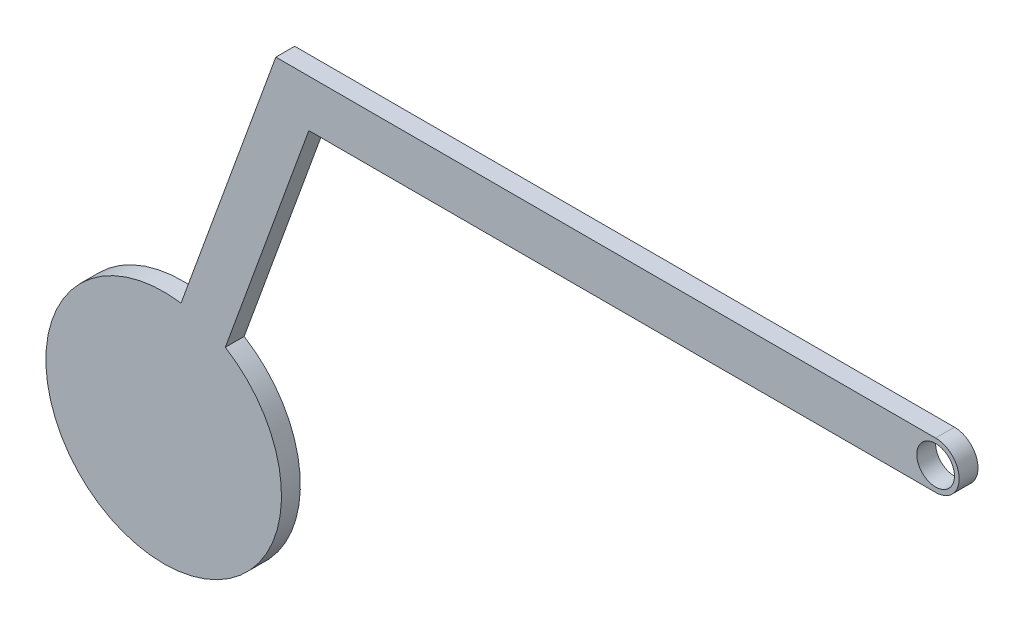
ISO-10303-21;
HEADER;
FILE_DESCRIPTION(('STEP AP214'),'2;1');
FILE_NAME('part.step','',(''),(''),'','','');
FILE_SCHEMA(('AUTOMOTIVE_DESIGN { 1 0 10303 214 1 1 1 1 }'));
ENDSEC;
DATA;
#1=APPLICATION_CONTEXT('core data for automotive mechanical design processes');
#2=APPLICATION_PROTOCOL_DEFINITION('international standard','automotive_design',2000,#1);
#3=PRODUCT_CONTEXT('',#1,'mechanical');
#4=PRODUCT('Part','Part','',(#3));
#5=PRODUCT_RELATED_PRODUCT_CATEGORY('part','',(#4));
#6=PRODUCT_DEFINITION_FORMATION('','',#4);
#7=PRODUCT_DEFINITION_CONTEXT('part definition',#1,'design');
#8=PRODUCT_DEFINITION('design','',#6,#7);
#9=PRODUCT_DEFINITION_SHAPE('','',#8);
#10=(LENGTH_UNIT() NAMED_UNIT(*) SI_UNIT(.MILLI.,.METRE.));
#11=(NAMED_UNIT(*) PLANE_ANGLE_UNIT() SI_UNIT($,.RADIAN.));
#12=(NAMED_UNIT(*) SI_UNIT($,.STERADIAN.) SOLID_ANGLE_UNIT());
#13=UNCERTAINTY_MEASURE_WITH_UNIT(LENGTH_MEASURE(1.E-05),#10,'distance_accuracy_value','');
#14=(GEOMETRIC_REPRESENTATION_CONTEXT(3) GLOBAL_UNCERTAINTY_ASSIGNED_CONTEXT((#13)) GLOBAL_UNIT_ASSIGNED_CONTEXT((#10,
#11,#12)) REPRESENTATION_CONTEXT('',''));
#15=CARTESIAN_POINT('',(0.,0.,0.));
#16=DIRECTION('',(0.,0.,1.));
#17=DIRECTION('',(1.,0.,0.));
#18=AXIS2_PLACEMENT_3D('',#15,#16,#17);
#19=CARTESIAN_POINT('',(9.50352638406391,33.4202056621128,2.));
#20=DIRECTION('',(-0.939692466867992,0.342020566211371,0.));
#21=DIRECTION('',(-0.342020566211371,-0.939692466867992,0.));
#22=AXIS2_PLACEMENT_3D('',#19,#20,#21);
#23=PLANE('',#22);
#24=DIRECTION('',(0.342020566211371,0.939692466867992,0.));
#25=VECTOR('',#24,1.);
#26=CARTESIAN_POINT('',(9.50352638406391,33.4202056621128,0.));
#27=LINE('',#26,#25);
#28=CARTESIAN_POINT('',(1.83964261254032,12.3638875382351,0.));
#29=VERTEX_POINT('',#28);
#30=CARTESIAN_POINT('',(11.8983790239911,40.,0.));
#31=VERTEX_POINT('',#30);
#32=EDGE_CURVE('E82',#29,#31,#27,.T.);
#33=ORIENTED_EDGE('',*,*,#32,.F.);
#34=DIRECTION('',(0.,0.,-1.));
#35=VECTOR('',#34,1.);
#36=CARTESIAN_POINT('',(1.83964261254032,12.3638875382351,2.));
#37=LINE('',#36,#35);
#38=CARTESIAN_POINT('',(1.83964261254032,12.3638875382351,2.));
#39=VERTEX_POINT('',#38);
#40=EDGE_CURVE('E54',#39,#29,#37,.T.);
#41=ORIENTED_EDGE('',*,*,#40,.F.);
#42=DIRECTION('',(0.342020566211253,0.939692466868036,0.));
#43=VECTOR('',#42,1.);
#44=CARTESIAN_POINT('',(1.83964261254032,12.3638875382351,2.));
#45=LINE('',#44,#43);
#46=CARTESIAN_POINT('',(11.8983790239911,40.,2.));
#47=VERTEX_POINT('',#46);
#48=EDGE_CURVE('E62',#39,#47,#45,.T.);
#49=ORIENTED_EDGE('',*,*,#48,.T.);
#50=DIRECTION('',(0.,0.,-1.));
#51=VECTOR('',#50,1.);
#52=CARTESIAN_POINT('',(11.8983790239911,40.,2.));
#53=LINE('',#52,#51);
#54=EDGE_CURVE('E11',#47,#31,#53,.T.);
#55=ORIENTED_EDGE('',*,*,#54,.T.);
#56=EDGE_LOOP('',(#33,#41,#49,#55));
#57=FACE_BOUND('',#56,.T.);
#58=ADVANCED_FACE('F43',(#57),#23,.T.);
#59=CARTESIAN_POINT('',(0.,0.,2.));
#60=DIRECTION('',(0.,0.,-1.));
#61=DIRECTION('',(-1.,0.,0.));
#62=AXIS2_PLACEMENT_3D('',#59,#60,#61);
#63=CYLINDRICAL_SURFACE('',#62,12.5);
#64=CARTESIAN_POINT('',(0.,0.,0.));
#65=DIRECTION('',(0.,0.,1.));
#66=DIRECTION('',(1.,0.,0.));
#67=AXIS2_PLACEMENT_3D('',#64,#65,#66);
#68=CIRCLE('',#67,12.5);
#69=CARTESIAN_POINT('',(6.5381057164706,10.6537868216073,0.));
#70=VERTEX_POINT('',#69);
#71=EDGE_CURVE('E125',#29,#70,#68,.T.);
#72=ORIENTED_EDGE('',*,*,#71,.T.);
#73=DIRECTION('',(0.,0.,-1.));
#74=VECTOR('',#73,1.);
#75=CARTESIAN_POINT('',(6.5381057164706,10.6537868216073,2.));
#76=LINE('',#75,#74);
#77=CARTESIAN_POINT('',(6.5381057164706,10.6537868216073,2.));
#78=VERTEX_POINT('',#77);
#79=EDGE_CURVE('E109',#78,#70,#76,.T.);
#80=ORIENTED_EDGE('',*,*,#79,.F.);
#81=CARTESIAN_POINT('',(0.,0.,2.));
#82=DIRECTION('',(0.,0.,1.));
#83=DIRECTION('',(1.,0.,0.));
#84=AXIS2_PLACEMENT_3D('',#81,#82,#83);
#85=CIRCLE('',#84,12.5);
#86=EDGE_CURVE('E115',#39,#78,#85,.T.);
#87=ORIENTED_EDGE('',*,*,#86,.F.);
#88=ORIENTED_EDGE('',*,*,#40,.T.);
#89=EDGE_LOOP('',(#72,#80,#87,#88));
#90=FACE_BOUND('',#89,.T.);
#91=ADVANCED_FACE('F123',(#90),#63,.T.);
#92=CARTESIAN_POINT('',(6.5381057164706,10.6537868216073,2.));
#93=DIRECTION('',(-0.939692466868025,0.342020566211281,0.));
#94=DIRECTION('',(-0.342020566211281,-0.939692466868025,0.));
#95=AXIS2_PLACEMENT_3D('',#92,#93,#94);
#96=PLANE('',#95);
#97=DIRECTION('',(0.342020566211281,0.939692466868025,0.));
#98=VECTOR('',#97,1.);
#99=CARTESIAN_POINT('',(6.5381057164706,10.6537868216073,0.));
#100=LINE('',#99,#98);
#101=CARTESIAN_POINT('',(15.399415038368,34.9999999999996,0.));
#102=VERTEX_POINT('',#101);
#103=EDGE_CURVE('E152',#70,#102,#100,.T.);
#104=ORIENTED_EDGE('',*,*,#103,.T.);
#105=DIRECTION('',(0.,0.,-1.));
#106=VECTOR('',#105,1.);
#107=CARTESIAN_POINT('',(15.399415038368,34.9999999999996,2.));
#108=LINE('',#107,#106);
#109=CARTESIAN_POINT('',(15.399415038368,34.9999999999996,2.));
#110=VERTEX_POINT('',#109);
#111=EDGE_CURVE('E112',#110,#102,#108,.T.);
#112=ORIENTED_EDGE('',*,*,#111,.F.);
#113=DIRECTION('',(-0.342020566211305,-0.939692466868016,0.));
#114=VECTOR('',#113,1.);
#115=CARTESIAN_POINT('',(15.399415038368,34.9999999999996,2.));
#116=LINE('',#115,#114);
#117=EDGE_CURVE('E105',#110,#78,#116,.T.);
#118=ORIENTED_EDGE('',*,*,#117,.T.);
#119=ORIENTED_EDGE('',*,*,#79,.T.);
#120=EDGE_LOOP('',(#104,#112,#118,#119));
#121=FACE_BOUND('',#120,.T.);
#122=ADVANCED_FACE('F107',(#121),#96,.F.);
#123=CARTESIAN_POINT('',(22.3624299476816,34.9999999999996,2.));
#124=DIRECTION('',(0.,-1.,0.));
#125=DIRECTION('',(0.,0.,-1.));
#126=AXIS2_PLACEMENT_3D('',#123,#124,#125);
#127=PLANE('',#126);
#128=DIRECTION('',(-1.,0.,0.));
#129=VECTOR('',#128,1.);
#130=CARTESIAN_POINT('',(22.3624299476816,34.9999999999996,0.));
#131=LINE('',#130,#129);
#132=CARTESIAN_POINT('',(81.8983790239912,35.,0.));
#133=VERTEX_POINT('',#132);
#134=EDGE_CURVE('E148',#133,#102,#131,.T.);
#135=ORIENTED_EDGE('',*,*,#134,.F.);
#136=DIRECTION('',(0.,0.,-1.));
#137=VECTOR('',#136,1.);
#138=CARTESIAN_POINT('',(81.8983790239912,35.,2.));
#139=LINE('',#138,#137);
#140=CARTESIAN_POINT('',(81.8983790239912,35.,2.));
#141=VERTEX_POINT('',#140);
#142=EDGE_CURVE('E131',#141,#133,#139,.T.);
#143=ORIENTED_EDGE('',*,*,#142,.F.);
#144=DIRECTION('',(1.,0.,0.));
#145=VECTOR('',#144,1.);
#146=CARTESIAN_POINT('',(22.3624299476816,34.9999999999996,2.));
#147=LINE('',#146,#145);
#148=EDGE_CURVE('E116',#110,#141,#147,.T.);
#149=ORIENTED_EDGE('',*,*,#148,.F.);
#150=ORIENTED_EDGE('',*,*,#111,.T.);
#151=EDGE_LOOP('',(#135,#143,#149,#150));
#152=FACE_BOUND('',#151,.T.);
#153=ADVANCED_FACE('F171',(#152),#127,.T.);
#154=CARTESIAN_POINT('',(81.8983790239912,37.5,2.));
#155=DIRECTION('',(0.,0.,-1.));
#156=DIRECTION('',(-1.,0.,0.));
#157=AXIS2_PLACEMENT_3D('',#154,#155,#156);
#158=CYLINDRICAL_SURFACE('',#157,2.5);
#159=CARTESIAN_POINT('',(81.8983790239912,37.5,0.));
#160=DIRECTION('',(0.,0.,1.));
#161=DIRECTION('',(1.,0.,0.));
#162=AXIS2_PLACEMENT_3D('',#159,#160,#161);
#163=CIRCLE('',#162,2.5);
#164=CARTESIAN_POINT('',(81.8983790239912,40.,0.));
#165=VERTEX_POINT('',#164);
#166=EDGE_CURVE('E145',#133,#165,#163,.T.);
#167=ORIENTED_EDGE('',*,*,#166,.T.);
#168=DIRECTION('',(0.,0.,-1.));
#169=VECTOR('',#168,1.);
#170=CARTESIAN_POINT('',(81.8983790239912,40.,2.));
#171=LINE('',#170,#169);
#172=CARTESIAN_POINT('',(81.8983790239912,40.,2.));
#173=VERTEX_POINT('',#172);
#174=EDGE_CURVE('E136',#173,#165,#171,.T.);
#175=ORIENTED_EDGE('',*,*,#174,.F.);
#176=CARTESIAN_POINT('',(81.8983790239912,37.5,2.));
#177=DIRECTION('',(0.,0.,1.));
#178=DIRECTION('',(1.,0.,0.));
#179=AXIS2_PLACEMENT_3D('',#176,#177,#178);
#180=CIRCLE('',#179,2.5);
#181=EDGE_CURVE('E160',#141,#173,#180,.T.);
#182=ORIENTED_EDGE('',*,*,#181,.F.);
#183=ORIENTED_EDGE('',*,*,#142,.T.);
#184=EDGE_LOOP('',(#167,#175,#182,#183));
#185=FACE_BOUND('',#184,.T.);
#186=ADVANCED_FACE('F174',(#185),#158,.T.);
#187=CARTESIAN_POINT('',(18.9004510527449,40.,2.));
#188=DIRECTION('',(0.,1.,0.));
#189=DIRECTION('',(0.,0.,1.));
#190=AXIS2_PLACEMENT_3D('',#187,#188,#189);
#191=PLANE('',#190);
#192=DIRECTION('',(1.,0.,0.));
#193=VECTOR('',#192,1.);
#194=CARTESIAN_POINT('',(18.9004510527449,40.,0.));
#195=LINE('',#194,#193);
#196=EDGE_CURVE('E88',#31,#165,#195,.T.);
#197=ORIENTED_EDGE('',*,*,#196,.F.);
#198=ORIENTED_EDGE('',*,*,#54,.F.);
#199=DIRECTION('',(1.,0.,0.));
#200=VECTOR('',#199,1.);
#201=CARTESIAN_POINT('',(11.8983790239911,40.,2.));
#202=LINE('',#201,#200);
#203=EDGE_CURVE('E93',#47,#173,#202,.T.);
#204=ORIENTED_EDGE('',*,*,#203,.T.);
#205=ORIENTED_EDGE('',*,*,#174,.T.);
#206=EDGE_LOOP('',(#197,#198,#204,#205));
#207=FACE_BOUND('',#206,.T.);
#208=ADVANCED_FACE('F45',(#207),#191,.T.);
#209=CARTESIAN_POINT('',(81.8983790239912,37.5,2.));
#210=DIRECTION('',(0.,0.,1.));
#211=DIRECTION('',(1.,0.,0.));
#212=AXIS2_PLACEMENT_3D('',#209,#210,#211);
#213=PLANE('',#212);
#214=CARTESIAN_POINT('',(81.8983790239912,37.5,2.));
#215=DIRECTION('',(0.,0.,1.));
#216=DIRECTION('',(1.,0.,0.));
#217=AXIS2_PLACEMENT_3D('',#214,#215,#216);
#218=CIRCLE('',#217,2.);
#219=CARTESIAN_POINT('',(83.8983790239912,37.5,2.));
#220=VERTEX_POINT('',#219);
#221=EDGE_CURVE('E165',#220,#220,#218,.T.);
#222=ORIENTED_EDGE('',*,*,#221,.F.);
#223=EDGE_LOOP('',(#222));
#224=FACE_BOUND('',#223,.T.);
#225=ORIENTED_EDGE('',*,*,#203,.F.);
#226=ORIENTED_EDGE('',*,*,#48,.F.);
#227=ORIENTED_EDGE('',*,*,#86,.T.);
#228=ORIENTED_EDGE('',*,*,#117,.F.);
#229=ORIENTED_EDGE('',*,*,#148,.T.);
#230=ORIENTED_EDGE('',*,*,#181,.T.);
#231=EDGE_LOOP('',(#225,#226,#227,#228,#229,#230));
#232=FACE_BOUND('',#231,.T.);
#233=ADVANCED_FACE('F119',(#224,#232),#213,.T.);
#234=CARTESIAN_POINT('',(81.8983790239912,37.5,0.));
#235=DIRECTION('',(0.,0.,1.));
#236=DIRECTION('',(1.,0.,0.));
#237=AXIS2_PLACEMENT_3D('',#234,#235,#236);
#238=PLANE('',#237);
#239=CARTESIAN_POINT('',(81.8983790239912,37.5,0.));
#240=DIRECTION('',(0.,0.,1.));
#241=DIRECTION('',(1.,0.,0.));
#242=AXIS2_PLACEMENT_3D('',#239,#240,#241);
#243=CIRCLE('',#242,2.);
#244=CARTESIAN_POINT('',(83.8983790239912,37.5,0.));
#245=VERTEX_POINT('',#244);
#246=EDGE_CURVE('E47',#245,#245,#243,.T.);
#247=ORIENTED_EDGE('',*,*,#246,.T.);
#248=EDGE_LOOP('',(#247));
#249=FACE_BOUND('',#248,.T.);
#250=ORIENTED_EDGE('',*,*,#32,.T.);
#251=ORIENTED_EDGE('',*,*,#196,.T.);
#252=ORIENTED_EDGE('',*,*,#166,.F.);
#253=ORIENTED_EDGE('',*,*,#134,.T.);
#254=ORIENTED_EDGE('',*,*,#103,.F.);
#255=ORIENTED_EDGE('',*,*,#71,.F.);
#256=EDGE_LOOP('',(#250,#251,#252,#253,#254,#255));
#257=FACE_BOUND('',#256,.T.);
#258=ADVANCED_FACE('F175',(#249,#257),#238,.F.);
#259=CARTESIAN_POINT('',(81.8983790239912,37.5,-3.));
#260=DIRECTION('',(0.,0.,1.));
#261=DIRECTION('',(1.,0.,0.));
#262=AXIS2_PLACEMENT_3D('',#259,#260,#261);
#263=CYLINDRICAL_SURFACE('',#262,2.);
#264=ORIENTED_EDGE('',*,*,#221,.T.);
#265=EDGE_LOOP('',(#264));
#266=FACE_BOUND('',#265,.T.);
#267=ORIENTED_EDGE('',*,*,#246,.F.);
#268=EDGE_LOOP('',(#267));
#269=FACE_BOUND('',#268,.T.);
#270=ADVANCED_FACE('F177',(#266,#269),#263,.F.);
#271=CLOSED_SHELL('',(#58,#91,#122,#153,#186,#208,#233,#258,#270));
#272=MANIFOLD_SOLID_BREP('B2',#271);
#273=ADVANCED_BREP_SHAPE_REPRESENTATION('',(#18,#272),#14);
#274=SHAPE_DEFINITION_REPRESENTATION(#9,#273);
ENDSEC;
END-ISO-10303-21;
